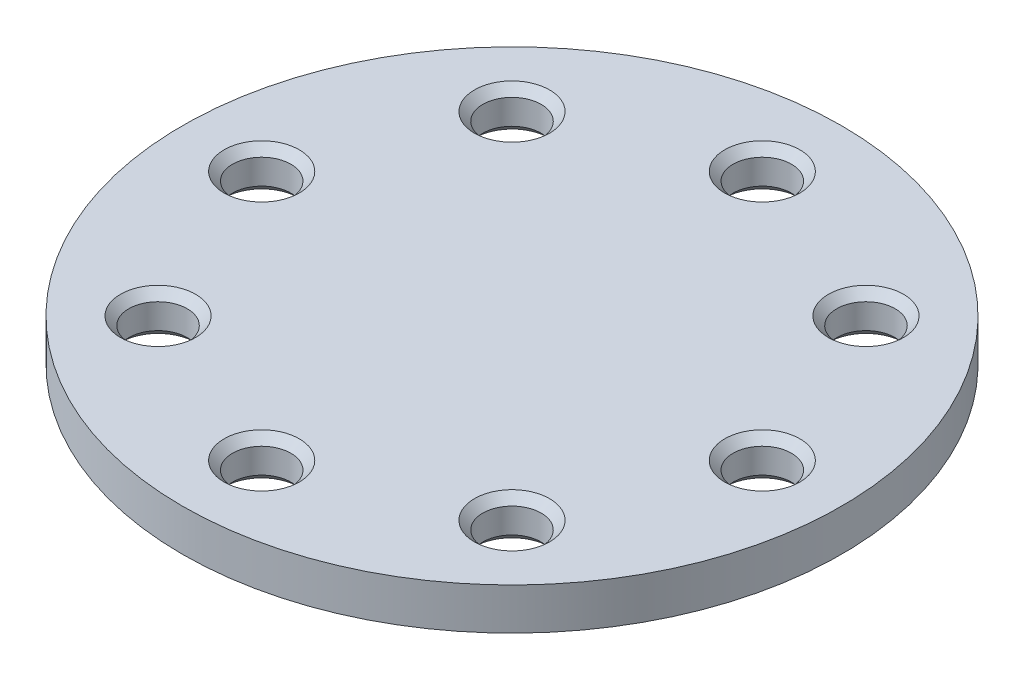
ISO-10303-21;
HEADER;
FILE_DESCRIPTION(('STEP AP214'),'2;1');
FILE_NAME('part.step','',(''),(''),'','','');
FILE_SCHEMA(('AUTOMOTIVE_DESIGN { 1 0 10303 214 1 1 1 1 }'));
ENDSEC;
DATA;
#1=APPLICATION_CONTEXT('core data for automotive mechanical design processes');
#2=APPLICATION_PROTOCOL_DEFINITION('international standard','automotive_design',2000,#1);
#3=PRODUCT_CONTEXT('',#1,'mechanical');
#4=PRODUCT('Part','Part','',(#3));
#5=PRODUCT_RELATED_PRODUCT_CATEGORY('part','',(#4));
#6=PRODUCT_DEFINITION_FORMATION('','',#4);
#7=PRODUCT_DEFINITION_CONTEXT('part definition',#1,'design');
#8=PRODUCT_DEFINITION('design','',#6,#7);
#9=PRODUCT_DEFINITION_SHAPE('','',#8);
#10=(LENGTH_UNIT() NAMED_UNIT(*) SI_UNIT(.MILLI.,.METRE.));
#11=(NAMED_UNIT(*) PLANE_ANGLE_UNIT() SI_UNIT($,.RADIAN.));
#12=(NAMED_UNIT(*) SI_UNIT($,.STERADIAN.) SOLID_ANGLE_UNIT());
#13=UNCERTAINTY_MEASURE_WITH_UNIT(LENGTH_MEASURE(1.E-05),#10,'distance_accuracy_value','');
#14=(GEOMETRIC_REPRESENTATION_CONTEXT(3) GLOBAL_UNCERTAINTY_ASSIGNED_CONTEXT((#13)) GLOBAL_UNIT_ASSIGNED_CONTEXT((#10,
#11,#12)) REPRESENTATION_CONTEXT('',''));
#15=CARTESIAN_POINT('',(0.,0.,0.));
#16=DIRECTION('',(0.,0.,1.));
#17=DIRECTION('',(1.,0.,0.));
#18=AXIS2_PLACEMENT_3D('',#15,#16,#17);
#19=CARTESIAN_POINT('',(0.,5.,-30.));
#20=DIRECTION('',(0.,-1.,0.));
#21=DIRECTION('',(0.,0.,-1.));
#22=AXIS2_PLACEMENT_3D('',#19,#20,#21);
#23=CYLINDRICAL_SURFACE('',#22,3.5);
#24=CARTESIAN_POINT('',(0.,0.999999999999997,-30.));
#25=DIRECTION('',(0.,1.,0.));
#26=DIRECTION('',(0.,0.,1.));
#27=AXIS2_PLACEMENT_3D('',#24,#25,#26);
#28=CIRCLE('',#27,3.5);
#29=CARTESIAN_POINT('',(0.,0.999999999999997,-26.5));
#30=VERTEX_POINT('',#29);
#31=EDGE_CURVE('E76',#30,#30,#28,.F.);
#32=ORIENTED_EDGE('',*,*,#31,.T.);
#33=EDGE_LOOP('',(#32));
#34=FACE_BOUND('',#33,.T.);
#35=CARTESIAN_POINT('',(0.,3.99999999999997,-30.));
#36=DIRECTION('',(0.,1.,0.));
#37=DIRECTION('',(0.,0.,1.));
#38=AXIS2_PLACEMENT_3D('',#35,#36,#37);
#39=CIRCLE('',#38,3.5);
#40=CARTESIAN_POINT('',(0.,3.99999999999997,-26.5));
#41=VERTEX_POINT('',#40);
#42=EDGE_CURVE('E79',#41,#41,#39,.T.);
#43=ORIENTED_EDGE('',*,*,#42,.T.);
#44=EDGE_LOOP('',(#43));
#45=FACE_BOUND('',#44,.T.);
#46=ADVANCED_FACE('F32',(#34,#45),#23,.F.);
#47=CARTESIAN_POINT('',(30.0000000000008,5.,-8.48977342514678E-13));
#48=DIRECTION('',(0.,-1.,0.));
#49=DIRECTION('',(0.,0.,-1.));
#50=AXIS2_PLACEMENT_3D('',#47,#48,#49);
#51=CYLINDRICAL_SURFACE('',#50,3.5);
#52=CARTESIAN_POINT('',(30.0000000000008,0.999999999999991,-8.48977342514678E-13));
#53=DIRECTION('',(0.,1.,0.));
#54=DIRECTION('',(0.,0.,1.));
#55=AXIS2_PLACEMENT_3D('',#52,#53,#54);
#56=CIRCLE('',#55,3.5);
#57=CARTESIAN_POINT('',(30.0000000000008,0.999999999999991,3.49999999999915));
#58=VERTEX_POINT('',#57);
#59=EDGE_CURVE('E52',#58,#58,#56,.F.);
#60=ORIENTED_EDGE('',*,*,#59,.T.);
#61=EDGE_LOOP('',(#60));
#62=FACE_BOUND('',#61,.T.);
#63=CARTESIAN_POINT('',(30.0000000000008,3.99999999999997,-8.48977342514678E-13));
#64=DIRECTION('',(0.,1.,0.));
#65=DIRECTION('',(0.,0.,1.));
#66=AXIS2_PLACEMENT_3D('',#63,#64,#65);
#67=CIRCLE('',#66,3.5);
#68=CARTESIAN_POINT('',(30.0000000000008,3.99999999999997,3.49999999999915));
#69=VERTEX_POINT('',#68);
#70=EDGE_CURVE('E55',#69,#69,#67,.T.);
#71=ORIENTED_EDGE('',*,*,#70,.T.);
#72=EDGE_LOOP('',(#71));
#73=FACE_BOUND('',#72,.T.);
#74=ADVANCED_FACE('F168',(#62,#73),#51,.F.);
#75=CARTESIAN_POINT('',(1.69795468502936E-12,5.,30.));
#76=DIRECTION('',(0.,-1.,0.));
#77=DIRECTION('',(0.,0.,-1.));
#78=AXIS2_PLACEMENT_3D('',#75,#76,#77);
#79=CYLINDRICAL_SURFACE('',#78,3.5);
#80=CARTESIAN_POINT('',(1.69795468502936E-12,3.99999999999997,30.));
#81=DIRECTION('',(0.,1.,0.));
#82=DIRECTION('',(0.,0.,1.));
#83=AXIS2_PLACEMENT_3D('',#80,#81,#82);
#84=CIRCLE('',#83,3.5);
#85=CARTESIAN_POINT('',(1.69795468502936E-12,3.99999999999997,33.5));
#86=VERTEX_POINT('',#85);
#87=EDGE_CURVE('E130',#86,#86,#84,.T.);
#88=ORIENTED_EDGE('',*,*,#87,.T.);
#89=EDGE_LOOP('',(#88));
#90=FACE_BOUND('',#89,.T.);
#91=CARTESIAN_POINT('',(1.69795468502936E-12,0.999999999999993,30.));
#92=DIRECTION('',(0.,1.,0.));
#93=DIRECTION('',(0.,0.,1.));
#94=AXIS2_PLACEMENT_3D('',#91,#92,#93);
#95=CIRCLE('',#94,3.5);
#96=CARTESIAN_POINT('',(1.69795468502936E-12,0.999999999999993,33.5));
#97=VERTEX_POINT('',#96);
#98=EDGE_CURVE('E133',#97,#97,#95,.F.);
#99=ORIENTED_EDGE('',*,*,#98,.T.);
#100=EDGE_LOOP('',(#99));
#101=FACE_BOUND('',#100,.T.);
#102=ADVANCED_FACE('F174',(#90,#101),#79,.F.);
#103=CARTESIAN_POINT('',(-29.9999999999992,5.,8.5265128291212E-13));
#104=DIRECTION('',(0.,-1.,0.));
#105=DIRECTION('',(0.,0.,-1.));
#106=AXIS2_PLACEMENT_3D('',#103,#104,#105);
#107=CYLINDRICAL_SURFACE('',#106,3.5);
#108=CARTESIAN_POINT('',(-29.9999999999992,0.999999999999991,8.5265128291212E-13));
#109=DIRECTION('',(0.,1.,0.));
#110=DIRECTION('',(0.,0.,1.));
#111=AXIS2_PLACEMENT_3D('',#108,#109,#110);
#112=CIRCLE('',#111,3.5);
#113=CARTESIAN_POINT('',(-29.9999999999992,0.999999999999991,3.50000000000085));
#114=VERTEX_POINT('',#113);
#115=EDGE_CURVE('E43',#114,#114,#112,.F.);
#116=ORIENTED_EDGE('',*,*,#115,.T.);
#117=EDGE_LOOP('',(#116));
#118=FACE_BOUND('',#117,.T.);
#119=CARTESIAN_POINT('',(-29.9999999999992,3.99999999999997,8.5265128291212E-13));
#120=DIRECTION('',(0.,1.,0.));
#121=DIRECTION('',(0.,0.,1.));
#122=AXIS2_PLACEMENT_3D('',#119,#120,#121);
#123=CIRCLE('',#122,3.5);
#124=CARTESIAN_POINT('',(-29.9999999999992,3.99999999999997,3.50000000000085));
#125=VERTEX_POINT('',#124);
#126=EDGE_CURVE('E47',#125,#125,#123,.T.);
#127=ORIENTED_EDGE('',*,*,#126,.T.);
#128=EDGE_LOOP('',(#127));
#129=FACE_BOUND('',#128,.T.);
#130=ADVANCED_FACE('F181',(#118,#129),#107,.F.);
#131=CARTESIAN_POINT('',(21.2132034355967,5.,-21.2132034355972));
#132=DIRECTION('',(0.,-1.,0.));
#133=DIRECTION('',(0.,0.,-1.));
#134=AXIS2_PLACEMENT_3D('',#131,#132,#133);
#135=CYLINDRICAL_SURFACE('',#134,3.5);
#136=CARTESIAN_POINT('',(21.2132034355967,3.99999999999998,-21.2132034355972));
#137=DIRECTION('',(0.,1.,0.));
#138=DIRECTION('',(0.,0.,1.));
#139=AXIS2_PLACEMENT_3D('',#136,#137,#138);
#140=CIRCLE('',#139,3.5);
#141=CARTESIAN_POINT('',(21.2132034355967,3.99999999999998,-17.7132034355972));
#142=VERTEX_POINT('',#141);
#143=EDGE_CURVE('E64',#142,#142,#140,.T.);
#144=ORIENTED_EDGE('',*,*,#143,.T.);
#145=EDGE_LOOP('',(#144));
#146=FACE_BOUND('',#145,.T.);
#147=CARTESIAN_POINT('',(21.2132034355967,1.00000000000002,-21.2132034355972));
#148=DIRECTION('',(0.,1.,0.));
#149=DIRECTION('',(0.,0.,1.));
#150=AXIS2_PLACEMENT_3D('',#147,#148,#149);
#151=CIRCLE('',#150,3.5);
#152=CARTESIAN_POINT('',(21.2132034355967,1.00000000000002,-17.7132034355972));
#153=VERTEX_POINT('',#152);
#154=EDGE_CURVE('E67',#153,#153,#151,.F.);
#155=ORIENTED_EDGE('',*,*,#154,.T.);
#156=EDGE_LOOP('',(#155));
#157=FACE_BOUND('',#156,.T.);
#158=ADVANCED_FACE('F185',(#146,#157),#135,.F.);
#159=CARTESIAN_POINT('',(21.2132034355982,5.,21.2132034355957));
#160=DIRECTION('',(0.,-1.,0.));
#161=DIRECTION('',(0.,0.,-1.));
#162=AXIS2_PLACEMENT_3D('',#159,#160,#161);
#163=CYLINDRICAL_SURFACE('',#162,3.5);
#164=CARTESIAN_POINT('',(21.2132034355982,1.00000000000002,21.2132034355957));
#165=DIRECTION('',(0.,1.,0.));
#166=DIRECTION('',(0.,0.,1.));
#167=AXIS2_PLACEMENT_3D('',#164,#165,#166);
#168=CIRCLE('',#167,3.5);
#169=CARTESIAN_POINT('',(21.2132034355982,1.00000000000002,24.7132034355957));
#170=VERTEX_POINT('',#169);
#171=EDGE_CURVE('E70',#170,#170,#168,.F.);
#172=ORIENTED_EDGE('',*,*,#171,.T.);
#173=EDGE_LOOP('',(#172));
#174=FACE_BOUND('',#173,.T.);
#175=CARTESIAN_POINT('',(21.2132034355982,3.99999999999998,21.2132034355957));
#176=DIRECTION('',(0.,1.,0.));
#177=DIRECTION('',(0.,0.,1.));
#178=AXIS2_PLACEMENT_3D('',#175,#176,#177);
#179=CIRCLE('',#178,3.5);
#180=CARTESIAN_POINT('',(21.2132034355982,3.99999999999998,24.7132034355957));
#181=VERTEX_POINT('',#180);
#182=EDGE_CURVE('E73',#181,#181,#179,.T.);
#183=ORIENTED_EDGE('',*,*,#182,.T.);
#184=EDGE_LOOP('',(#183));
#185=FACE_BOUND('',#184,.T.);
#186=ADVANCED_FACE('F189',(#174,#185),#163,.F.);
#187=CARTESIAN_POINT('',(-21.2132034355946,5.,21.2132034355972));
#188=DIRECTION('',(0.,-1.,0.));
#189=DIRECTION('',(0.,0.,-1.));
#190=AXIS2_PLACEMENT_3D('',#187,#188,#189);
#191=CYLINDRICAL_SURFACE('',#190,3.5);
#192=CARTESIAN_POINT('',(-21.2132034355946,1.00000000000002,21.2132034355972));
#193=DIRECTION('',(0.,1.,0.));
#194=DIRECTION('',(0.,0.,1.));
#195=AXIS2_PLACEMENT_3D('',#192,#193,#194);
#196=CIRCLE('',#195,3.5);
#197=CARTESIAN_POINT('',(-21.2132034355946,1.00000000000002,24.7132034355972));
#198=VERTEX_POINT('',#197);
#199=EDGE_CURVE('E10',#198,#198,#196,.F.);
#200=ORIENTED_EDGE('',*,*,#199,.T.);
#201=EDGE_LOOP('',(#200));
#202=FACE_BOUND('',#201,.T.);
#203=CARTESIAN_POINT('',(-21.2132034355946,3.99999999999998,21.2132034355972));
#204=DIRECTION('',(0.,1.,0.));
#205=DIRECTION('',(0.,0.,1.));
#206=AXIS2_PLACEMENT_3D('',#203,#204,#205);
#207=CIRCLE('',#206,3.5);
#208=CARTESIAN_POINT('',(-21.2132034355946,3.99999999999998,24.7132034355972));
#209=VERTEX_POINT('',#208);
#210=EDGE_CURVE('E39',#209,#209,#207,.T.);
#211=ORIENTED_EDGE('',*,*,#210,.T.);
#212=EDGE_LOOP('',(#211));
#213=FACE_BOUND('',#212,.T.);
#214=ADVANCED_FACE('F193',(#202,#213),#191,.F.);
#215=CARTESIAN_POINT('',(-21.2132034355961,5.,-21.2132034355957));
#216=DIRECTION('',(0.,-1.,0.));
#217=DIRECTION('',(0.,0.,-1.));
#218=AXIS2_PLACEMENT_3D('',#215,#216,#217);
#219=CYLINDRICAL_SURFACE('',#218,3.5);
#220=CARTESIAN_POINT('',(-21.2132034355961,3.99999999999998,-21.2132034355957));
#221=DIRECTION('',(0.,1.,0.));
#222=DIRECTION('',(0.,0.,1.));
#223=AXIS2_PLACEMENT_3D('',#220,#221,#222);
#224=CIRCLE('',#223,3.5);
#225=CARTESIAN_POINT('',(-21.2132034355961,3.99999999999998,-17.7132034355957));
#226=VERTEX_POINT('',#225);
#227=EDGE_CURVE('E58',#226,#226,#224,.T.);
#228=ORIENTED_EDGE('',*,*,#227,.T.);
#229=EDGE_LOOP('',(#228));
#230=FACE_BOUND('',#229,.T.);
#231=CARTESIAN_POINT('',(-21.2132034355961,1.00000000000002,-21.2132034355957));
#232=DIRECTION('',(0.,1.,0.));
#233=DIRECTION('',(0.,0.,1.));
#234=AXIS2_PLACEMENT_3D('',#231,#232,#233);
#235=CIRCLE('',#234,3.5);
#236=CARTESIAN_POINT('',(-21.2132034355961,1.00000000000002,-17.7132034355957));
#237=VERTEX_POINT('',#236);
#238=EDGE_CURVE('E61',#237,#237,#235,.F.);
#239=ORIENTED_EDGE('',*,*,#238,.T.);
#240=EDGE_LOOP('',(#239));
#241=FACE_BOUND('',#240,.T.);
#242=ADVANCED_FACE('F148',(#230,#241),#219,.F.);
#243=CARTESIAN_POINT('',(0.,5.,0.));
#244=DIRECTION('',(0.,-1.,0.));
#245=DIRECTION('',(0.,0.,-1.));
#246=AXIS2_PLACEMENT_3D('',#243,#244,#245);
#247=CYLINDRICAL_SURFACE('',#246,39.5);
#248=CARTESIAN_POINT('',(0.,5.,0.));
#249=DIRECTION('',(0.,1.,0.));
#250=DIRECTION('',(0.,0.,1.));
#251=AXIS2_PLACEMENT_3D('',#248,#249,#250);
#252=CIRCLE('',#251,39.5);
#253=CARTESIAN_POINT('',(0.,5.,39.5));
#254=VERTEX_POINT('',#253);
#255=EDGE_CURVE('E136',#254,#254,#252,.T.);
#256=ORIENTED_EDGE('',*,*,#255,.F.);
#257=EDGE_LOOP('',(#256));
#258=FACE_BOUND('',#257,.T.);
#259=CARTESIAN_POINT('',(0.,0.,0.));
#260=DIRECTION('',(0.,1.,0.));
#261=DIRECTION('',(0.,0.,1.));
#262=AXIS2_PLACEMENT_3D('',#259,#260,#261);
#263=CIRCLE('',#262,39.5);
#264=CARTESIAN_POINT('',(0.,0.,39.5));
#265=VERTEX_POINT('',#264);
#266=EDGE_CURVE('E137',#265,#265,#263,.T.);
#267=ORIENTED_EDGE('',*,*,#266,.T.);
#268=EDGE_LOOP('',(#267));
#269=FACE_BOUND('',#268,.T.);
#270=ADVANCED_FACE('F145',(#258,#269),#247,.T.);
#271=CARTESIAN_POINT('',(0.,5.,0.));
#272=DIRECTION('',(0.,1.,0.));
#273=DIRECTION('',(0.,0.,1.));
#274=AXIS2_PLACEMENT_3D('',#271,#272,#273);
#275=PLANE('',#274);
#276=CARTESIAN_POINT('',(1.69795468502936E-12,5.,30.));
#277=DIRECTION('',(0.,1.,0.));
#278=DIRECTION('',(0.,0.,1.));
#279=AXIS2_PLACEMENT_3D('',#276,#277,#278);
#280=CIRCLE('',#279,4.50000000000003);
#281=CARTESIAN_POINT('',(1.69795468502936E-12,5.,34.5));
#282=VERTEX_POINT('',#281);
#283=EDGE_CURVE('E106',#282,#282,#280,.F.);
#284=ORIENTED_EDGE('',*,*,#283,.T.);
#285=EDGE_LOOP('',(#284));
#286=FACE_BOUND('',#285,.T.);
#287=CARTESIAN_POINT('',(0.,5.,-30.));
#288=DIRECTION('',(0.,1.,0.));
#289=DIRECTION('',(0.,0.,1.));
#290=AXIS2_PLACEMENT_3D('',#287,#288,#289);
#291=CIRCLE('',#290,4.50000000000003);
#292=CARTESIAN_POINT('',(0.,5.,-25.5));
#293=VERTEX_POINT('',#292);
#294=EDGE_CURVE('E109',#293,#293,#291,.F.);
#295=ORIENTED_EDGE('',*,*,#294,.T.);
#296=EDGE_LOOP('',(#295));
#297=FACE_BOUND('',#296,.T.);
#298=CARTESIAN_POINT('',(21.2132034355982,5.,21.2132034355957));
#299=DIRECTION('',(0.,1.,0.));
#300=DIRECTION('',(0.,0.,1.));
#301=AXIS2_PLACEMENT_3D('',#298,#299,#300);
#302=CIRCLE('',#301,4.50000000000003);
#303=CARTESIAN_POINT('',(21.2132034355982,5.,25.7132034355957));
#304=VERTEX_POINT('',#303);
#305=EDGE_CURVE('E112',#304,#304,#302,.F.);
#306=ORIENTED_EDGE('',*,*,#305,.T.);
#307=EDGE_LOOP('',(#306));
#308=FACE_BOUND('',#307,.T.);
#309=CARTESIAN_POINT('',(21.2132034355967,5.,-21.2132034355972));
#310=DIRECTION('',(0.,1.,0.));
#311=DIRECTION('',(0.,0.,1.));
#312=AXIS2_PLACEMENT_3D('',#309,#310,#311);
#313=CIRCLE('',#312,4.50000000000003);
#314=CARTESIAN_POINT('',(21.2132034355967,5.,-16.7132034355971));
#315=VERTEX_POINT('',#314);
#316=EDGE_CURVE('E115',#315,#315,#313,.F.);
#317=ORIENTED_EDGE('',*,*,#316,.T.);
#318=EDGE_LOOP('',(#317));
#319=FACE_BOUND('',#318,.T.);
#320=CARTESIAN_POINT('',(-21.2132034355961,5.,-21.2132034355957));
#321=DIRECTION('',(0.,1.,0.));
#322=DIRECTION('',(0.,0.,1.));
#323=AXIS2_PLACEMENT_3D('',#320,#321,#322);
#324=CIRCLE('',#323,4.50000000000003);
#325=CARTESIAN_POINT('',(-21.2132034355961,5.,-16.7132034355956));
#326=VERTEX_POINT('',#325);
#327=EDGE_CURVE('E118',#326,#326,#324,.F.);
#328=ORIENTED_EDGE('',*,*,#327,.T.);
#329=EDGE_LOOP('',(#328));
#330=FACE_BOUND('',#329,.T.);
#331=CARTESIAN_POINT('',(-29.9999999999992,5.,8.5265128291212E-13));
#332=DIRECTION('',(0.,1.,0.));
#333=DIRECTION('',(0.,0.,1.));
#334=AXIS2_PLACEMENT_3D('',#331,#332,#333);
#335=CIRCLE('',#334,4.50000000000003);
#336=CARTESIAN_POINT('',(-29.9999999999992,5.,4.50000000000088));
#337=VERTEX_POINT('',#336);
#338=EDGE_CURVE('E121',#337,#337,#335,.F.);
#339=ORIENTED_EDGE('',*,*,#338,.T.);
#340=EDGE_LOOP('',(#339));
#341=FACE_BOUND('',#340,.T.);
#342=CARTESIAN_POINT('',(-21.2132034355946,5.,21.2132034355972));
#343=DIRECTION('',(0.,1.,0.));
#344=DIRECTION('',(0.,0.,1.));
#345=AXIS2_PLACEMENT_3D('',#342,#343,#344);
#346=CIRCLE('',#345,4.50000000000003);
#347=CARTESIAN_POINT('',(-21.2132034355946,5.,25.7132034355972));
#348=VERTEX_POINT('',#347);
#349=EDGE_CURVE('E124',#348,#348,#346,.F.);
#350=ORIENTED_EDGE('',*,*,#349,.T.);
#351=EDGE_LOOP('',(#350));
#352=FACE_BOUND('',#351,.T.);
#353=CARTESIAN_POINT('',(30.0000000000008,5.,-8.48977342514678E-13));
#354=DIRECTION('',(0.,1.,0.));
#355=DIRECTION('',(0.,0.,1.));
#356=AXIS2_PLACEMENT_3D('',#353,#354,#355);
#357=CIRCLE('',#356,4.50000000000003);
#358=CARTESIAN_POINT('',(30.0000000000008,5.,4.49999999999918));
#359=VERTEX_POINT('',#358);
#360=EDGE_CURVE('E127',#359,#359,#357,.F.);
#361=ORIENTED_EDGE('',*,*,#360,.T.);
#362=EDGE_LOOP('',(#361));
#363=FACE_BOUND('',#362,.T.);
#364=ORIENTED_EDGE('',*,*,#255,.T.);
#365=EDGE_LOOP('',(#364));
#366=FACE_BOUND('',#365,.T.);
#367=ADVANCED_FACE('F143',(#286,#297,#308,#319,#330,#341,#352,#363,#366),#275,.T.);
#368=CARTESIAN_POINT('',(0.,0.,0.));
#369=DIRECTION('',(0.,1.,0.));
#370=DIRECTION('',(0.,0.,1.));
#371=AXIS2_PLACEMENT_3D('',#368,#369,#370);
#372=PLANE('',#371);
#373=CARTESIAN_POINT('',(0.,0.,-30.));
#374=DIRECTION('',(0.,1.,0.));
#375=DIRECTION('',(0.,0.,1.));
#376=AXIS2_PLACEMENT_3D('',#373,#374,#375);
#377=CIRCLE('',#376,4.49999999999999);
#378=CARTESIAN_POINT('',(0.,0.,-25.5));
#379=VERTEX_POINT('',#378);
#380=EDGE_CURVE('E82',#379,#379,#377,.T.);
#381=ORIENTED_EDGE('',*,*,#380,.T.);
#382=EDGE_LOOP('',(#381));
#383=FACE_BOUND('',#382,.T.);
#384=CARTESIAN_POINT('',(21.2132034355982,0.,21.2132034355957));
#385=DIRECTION('',(0.,1.,0.));
#386=DIRECTION('',(0.,0.,1.));
#387=AXIS2_PLACEMENT_3D('',#384,#385,#386);
#388=CIRCLE('',#387,4.5);
#389=CARTESIAN_POINT('',(21.2132034355982,0.,25.7132034355957));
#390=VERTEX_POINT('',#389);
#391=EDGE_CURVE('E85',#390,#390,#388,.T.);
#392=ORIENTED_EDGE('',*,*,#391,.T.);
#393=EDGE_LOOP('',(#392));
#394=FACE_BOUND('',#393,.T.);
#395=CARTESIAN_POINT('',(1.69795468502936E-12,0.,30.));
#396=DIRECTION('',(0.,1.,0.));
#397=DIRECTION('',(0.,0.,1.));
#398=AXIS2_PLACEMENT_3D('',#395,#396,#397);
#399=CIRCLE('',#398,4.49999999999999);
#400=CARTESIAN_POINT('',(1.69795468502936E-12,0.,34.5));
#401=VERTEX_POINT('',#400);
#402=EDGE_CURVE('E88',#401,#401,#399,.T.);
#403=ORIENTED_EDGE('',*,*,#402,.T.);
#404=EDGE_LOOP('',(#403));
#405=FACE_BOUND('',#404,.T.);
#406=CARTESIAN_POINT('',(30.0000000000008,0.,-8.48977342514678E-13));
#407=DIRECTION('',(0.,1.,0.));
#408=DIRECTION('',(0.,0.,1.));
#409=AXIS2_PLACEMENT_3D('',#406,#407,#408);
#410=CIRCLE('',#409,4.49999999999999);
#411=CARTESIAN_POINT('',(30.0000000000008,0.,4.49999999999914));
#412=VERTEX_POINT('',#411);
#413=EDGE_CURVE('E91',#412,#412,#410,.T.);
#414=ORIENTED_EDGE('',*,*,#413,.T.);
#415=EDGE_LOOP('',(#414));
#416=FACE_BOUND('',#415,.T.);
#417=CARTESIAN_POINT('',(21.2132034355967,0.,-21.2132034355972));
#418=DIRECTION('',(0.,1.,0.));
#419=DIRECTION('',(0.,0.,1.));
#420=AXIS2_PLACEMENT_3D('',#417,#418,#419);
#421=CIRCLE('',#420,4.5);
#422=CARTESIAN_POINT('',(21.2132034355967,0.,-16.7132034355972));
#423=VERTEX_POINT('',#422);
#424=EDGE_CURVE('E94',#423,#423,#421,.T.);
#425=ORIENTED_EDGE('',*,*,#424,.T.);
#426=EDGE_LOOP('',(#425));
#427=FACE_BOUND('',#426,.T.);
#428=CARTESIAN_POINT('',(-21.2132034355961,0.,-21.2132034355957));
#429=DIRECTION('',(0.,1.,0.));
#430=DIRECTION('',(0.,0.,1.));
#431=AXIS2_PLACEMENT_3D('',#428,#429,#430);
#432=CIRCLE('',#431,4.5);
#433=CARTESIAN_POINT('',(-21.2132034355961,0.,-16.7132034355957));
#434=VERTEX_POINT('',#433);
#435=EDGE_CURVE('E97',#434,#434,#432,.T.);
#436=ORIENTED_EDGE('',*,*,#435,.T.);
#437=EDGE_LOOP('',(#436));
#438=FACE_BOUND('',#437,.T.);
#439=CARTESIAN_POINT('',(-29.9999999999992,0.,8.5265128291212E-13));
#440=DIRECTION('',(0.,1.,0.));
#441=DIRECTION('',(0.,0.,1.));
#442=AXIS2_PLACEMENT_3D('',#439,#440,#441);
#443=CIRCLE('',#442,4.49999999999999);
#444=CARTESIAN_POINT('',(-29.9999999999992,0.,4.50000000000084));
#445=VERTEX_POINT('',#444);
#446=EDGE_CURVE('E100',#445,#445,#443,.T.);
#447=ORIENTED_EDGE('',*,*,#446,.T.);
#448=EDGE_LOOP('',(#447));
#449=FACE_BOUND('',#448,.T.);
#450=CARTESIAN_POINT('',(-21.2132034355946,0.,21.2132034355972));
#451=DIRECTION('',(0.,1.,0.));
#452=DIRECTION('',(0.,0.,1.));
#453=AXIS2_PLACEMENT_3D('',#450,#451,#452);
#454=CIRCLE('',#453,4.5);
#455=CARTESIAN_POINT('',(-21.2132034355946,0.,25.7132034355972));
#456=VERTEX_POINT('',#455);
#457=EDGE_CURVE('E103',#456,#456,#454,.T.);
#458=ORIENTED_EDGE('',*,*,#457,.T.);
#459=EDGE_LOOP('',(#458));
#460=FACE_BOUND('',#459,.T.);
#461=ORIENTED_EDGE('',*,*,#266,.F.);
#462=EDGE_LOOP('',(#461));
#463=FACE_BOUND('',#462,.T.);
#464=ADVANCED_FACE('F152',(#383,#394,#405,#416,#427,#438,#449,#460,#463),#372,.F.);
#465=CARTESIAN_POINT('',(1.69795468502936E-12,3.99999999999997,30.));
#466=DIRECTION('',(0.,1.,0.));
#467=DIRECTION('',(0.,0.,1.));
#468=AXIS2_PLACEMENT_3D('',#465,#466,#467);
#469=CONICAL_SURFACE('',#468,3.5,0.785398163397449);
#470=ORIENTED_EDGE('',*,*,#283,.F.);
#471=EDGE_LOOP('',(#470));
#472=FACE_BOUND('',#471,.T.);
#473=ORIENTED_EDGE('',*,*,#87,.F.);
#474=EDGE_LOOP('',(#473));
#475=FACE_BOUND('',#474,.T.);
#476=ADVANCED_FACE('F154',(#472,#475),#469,.F.);
#477=CARTESIAN_POINT('',(0.,0.,-30.));
#478=DIRECTION('',(0.,-1.,0.));
#479=DIRECTION('',(0.,0.,-1.));
#480=AXIS2_PLACEMENT_3D('',#477,#478,#479);
#481=CONICAL_SURFACE('',#480,4.49999999999999,0.785398163397446);
#482=ORIENTED_EDGE('',*,*,#31,.F.);
#483=EDGE_LOOP('',(#482));
#484=FACE_BOUND('',#483,.T.);
#485=ORIENTED_EDGE('',*,*,#380,.F.);
#486=EDGE_LOOP('',(#485));
#487=FACE_BOUND('',#486,.T.);
#488=ADVANCED_FACE('F161',(#484,#487),#481,.F.);
#489=CARTESIAN_POINT('',(0.,3.99999999999997,-30.));
#490=DIRECTION('',(0.,1.,0.));
#491=DIRECTION('',(0.,0.,1.));
#492=AXIS2_PLACEMENT_3D('',#489,#490,#491);
#493=CONICAL_SURFACE('',#492,3.5,0.785398163397449);
#494=ORIENTED_EDGE('',*,*,#294,.F.);
#495=EDGE_LOOP('',(#494));
#496=FACE_BOUND('',#495,.T.);
#497=ORIENTED_EDGE('',*,*,#42,.F.);
#498=EDGE_LOOP('',(#497));
#499=FACE_BOUND('',#498,.T.);
#500=ADVANCED_FACE('F202',(#496,#499),#493,.F.);
#501=CARTESIAN_POINT('',(21.2132034355982,0.,21.2132034355957));
#502=DIRECTION('',(0.,-1.,0.));
#503=DIRECTION('',(0.,0.,-1.));
#504=AXIS2_PLACEMENT_3D('',#501,#502,#503);
#505=CONICAL_SURFACE('',#504,4.5,0.785398163397441);
#506=ORIENTED_EDGE('',*,*,#171,.F.);
#507=EDGE_LOOP('',(#506));
#508=FACE_BOUND('',#507,.T.);
#509=ORIENTED_EDGE('',*,*,#391,.F.);
#510=EDGE_LOOP('',(#509));
#511=FACE_BOUND('',#510,.T.);
#512=ADVANCED_FACE('F206',(#508,#511),#505,.F.);
#513=CARTESIAN_POINT('',(21.2132034355982,3.99999999999998,21.2132034355957));
#514=DIRECTION('',(0.,1.,0.));
#515=DIRECTION('',(0.,0.,1.));
#516=AXIS2_PLACEMENT_3D('',#513,#514,#515);
#517=CONICAL_SURFACE('',#516,3.5,0.785398163397456);
#518=ORIENTED_EDGE('',*,*,#305,.F.);
#519=EDGE_LOOP('',(#518));
#520=FACE_BOUND('',#519,.T.);
#521=ORIENTED_EDGE('',*,*,#182,.F.);
#522=EDGE_LOOP('',(#521));
#523=FACE_BOUND('',#522,.T.);
#524=ADVANCED_FACE('F210',(#520,#523),#517,.F.);
#525=CARTESIAN_POINT('',(1.69795468502936E-12,0.,30.));
#526=DIRECTION('',(0.,-1.,0.));
#527=DIRECTION('',(0.,0.,-1.));
#528=AXIS2_PLACEMENT_3D('',#525,#526,#527);
#529=CONICAL_SURFACE('',#528,4.49999999999999,0.785398163397448);
#530=ORIENTED_EDGE('',*,*,#98,.F.);
#531=EDGE_LOOP('',(#530));
#532=FACE_BOUND('',#531,.T.);
#533=ORIENTED_EDGE('',*,*,#402,.F.);
#534=EDGE_LOOP('',(#533));
#535=FACE_BOUND('',#534,.T.);
#536=ADVANCED_FACE('F214',(#532,#535),#529,.F.);
#537=CARTESIAN_POINT('',(21.2132034355967,3.99999999999998,-21.2132034355972));
#538=DIRECTION('',(0.,1.,0.));
#539=DIRECTION('',(0.,0.,1.));
#540=AXIS2_PLACEMENT_3D('',#537,#538,#539);
#541=CONICAL_SURFACE('',#540,3.5,0.785398163397456);
#542=ORIENTED_EDGE('',*,*,#316,.F.);
#543=EDGE_LOOP('',(#542));
#544=FACE_BOUND('',#543,.T.);
#545=ORIENTED_EDGE('',*,*,#143,.F.);
#546=EDGE_LOOP('',(#545));
#547=FACE_BOUND('',#546,.T.);
#548=ADVANCED_FACE('F218',(#544,#547),#541,.F.);
#549=CARTESIAN_POINT('',(-21.2132034355961,3.99999999999998,-21.2132034355957));
#550=DIRECTION('',(0.,1.,0.));
#551=DIRECTION('',(0.,0.,1.));
#552=AXIS2_PLACEMENT_3D('',#549,#550,#551);
#553=CONICAL_SURFACE('',#552,3.5,0.785398163397456);
#554=ORIENTED_EDGE('',*,*,#327,.F.);
#555=EDGE_LOOP('',(#554));
#556=FACE_BOUND('',#555,.T.);
#557=ORIENTED_EDGE('',*,*,#227,.F.);
#558=EDGE_LOOP('',(#557));
#559=FACE_BOUND('',#558,.T.);
#560=ADVANCED_FACE('F222',(#556,#559),#553,.F.);
#561=CARTESIAN_POINT('',(30.0000000000008,0.,-8.48977342514678E-13));
#562=DIRECTION('',(0.,-1.,0.));
#563=DIRECTION('',(0.,0.,-1.));
#564=AXIS2_PLACEMENT_3D('',#561,#562,#563);
#565=CONICAL_SURFACE('',#564,4.49999999999999,0.785398163397448);
#566=ORIENTED_EDGE('',*,*,#59,.F.);
#567=EDGE_LOOP('',(#566));
#568=FACE_BOUND('',#567,.T.);
#569=ORIENTED_EDGE('',*,*,#413,.F.);
#570=EDGE_LOOP('',(#569));
#571=FACE_BOUND('',#570,.T.);
#572=ADVANCED_FACE('F226',(#568,#571),#565,.F.);
#573=CARTESIAN_POINT('',(21.2132034355967,0.,-21.2132034355972));
#574=DIRECTION('',(0.,-1.,0.));
#575=DIRECTION('',(0.,0.,-1.));
#576=AXIS2_PLACEMENT_3D('',#573,#574,#575);
#577=CONICAL_SURFACE('',#576,4.5,0.785398163397441);
#578=ORIENTED_EDGE('',*,*,#154,.F.);
#579=EDGE_LOOP('',(#578));
#580=FACE_BOUND('',#579,.T.);
#581=ORIENTED_EDGE('',*,*,#424,.F.);
#582=EDGE_LOOP('',(#581));
#583=FACE_BOUND('',#582,.T.);
#584=ADVANCED_FACE('F230',(#580,#583),#577,.F.);
#585=CARTESIAN_POINT('',(-21.2132034355961,0.,-21.2132034355957));
#586=DIRECTION('',(0.,-1.,0.));
#587=DIRECTION('',(0.,0.,-1.));
#588=AXIS2_PLACEMENT_3D('',#585,#586,#587);
#589=CONICAL_SURFACE('',#588,4.5,0.785398163397441);
#590=ORIENTED_EDGE('',*,*,#238,.F.);
#591=EDGE_LOOP('',(#590));
#592=FACE_BOUND('',#591,.T.);
#593=ORIENTED_EDGE('',*,*,#435,.F.);
#594=EDGE_LOOP('',(#593));
#595=FACE_BOUND('',#594,.T.);
#596=ADVANCED_FACE('F234',(#592,#595),#589,.F.);
#597=CARTESIAN_POINT('',(-29.9999999999992,0.,8.5265128291212E-13));
#598=DIRECTION('',(0.,-1.,0.));
#599=DIRECTION('',(0.,0.,-1.));
#600=AXIS2_PLACEMENT_3D('',#597,#598,#599);
#601=CONICAL_SURFACE('',#600,4.49999999999999,0.785398163397448);
#602=ORIENTED_EDGE('',*,*,#115,.F.);
#603=EDGE_LOOP('',(#602));
#604=FACE_BOUND('',#603,.T.);
#605=ORIENTED_EDGE('',*,*,#446,.F.);
#606=EDGE_LOOP('',(#605));
#607=FACE_BOUND('',#606,.T.);
#608=ADVANCED_FACE('F238',(#604,#607),#601,.F.);
#609=CARTESIAN_POINT('',(-21.2132034355946,0.,21.2132034355972));
#610=DIRECTION('',(0.,-1.,0.));
#611=DIRECTION('',(0.,0.,-1.));
#612=AXIS2_PLACEMENT_3D('',#609,#610,#611);
#613=CONICAL_SURFACE('',#612,4.5,0.785398163397441);
#614=ORIENTED_EDGE('',*,*,#199,.F.);
#615=EDGE_LOOP('',(#614));
#616=FACE_BOUND('',#615,.T.);
#617=ORIENTED_EDGE('',*,*,#457,.F.);
#618=EDGE_LOOP('',(#617));
#619=FACE_BOUND('',#618,.T.);
#620=ADVANCED_FACE('F242',(#616,#619),#613,.F.);
#621=CARTESIAN_POINT('',(-29.9999999999992,3.99999999999997,8.5265128291212E-13));
#622=DIRECTION('',(0.,1.,0.));
#623=DIRECTION('',(0.,0.,1.));
#624=AXIS2_PLACEMENT_3D('',#621,#622,#623);
#625=CONICAL_SURFACE('',#624,3.5,0.785398163397449);
#626=ORIENTED_EDGE('',*,*,#338,.F.);
#627=EDGE_LOOP('',(#626));
#628=FACE_BOUND('',#627,.T.);
#629=ORIENTED_EDGE('',*,*,#126,.F.);
#630=EDGE_LOOP('',(#629));
#631=FACE_BOUND('',#630,.T.);
#632=ADVANCED_FACE('F246',(#628,#631),#625,.F.);
#633=CARTESIAN_POINT('',(-21.2132034355946,3.99999999999998,21.2132034355972));
#634=DIRECTION('',(0.,1.,0.));
#635=DIRECTION('',(0.,0.,1.));
#636=AXIS2_PLACEMENT_3D('',#633,#634,#635);
#637=CONICAL_SURFACE('',#636,3.5,0.785398163397456);
#638=ORIENTED_EDGE('',*,*,#349,.F.);
#639=EDGE_LOOP('',(#638));
#640=FACE_BOUND('',#639,.T.);
#641=ORIENTED_EDGE('',*,*,#210,.F.);
#642=EDGE_LOOP('',(#641));
#643=FACE_BOUND('',#642,.T.);
#644=ADVANCED_FACE('F249',(#640,#643),#637,.F.);
#645=CARTESIAN_POINT('',(30.0000000000008,3.99999999999997,-8.48977342514678E-13));
#646=DIRECTION('',(0.,1.,0.));
#647=DIRECTION('',(0.,0.,1.));
#648=AXIS2_PLACEMENT_3D('',#645,#646,#647);
#649=CONICAL_SURFACE('',#648,3.5,0.785398163397449);
#650=ORIENTED_EDGE('',*,*,#360,.F.);
#651=EDGE_LOOP('',(#650));
#652=FACE_BOUND('',#651,.T.);
#653=ORIENTED_EDGE('',*,*,#70,.F.);
#654=EDGE_LOOP('',(#653));
#655=FACE_BOUND('',#654,.T.);
#656=ADVANCED_FACE('F34',(#652,#655),#649,.F.);
#657=CLOSED_SHELL('',(#46,#74,#102,#130,#158,#186,#214,#242,#270,#367,#464,#476,#488,#500,#512,
#524,#536,#548,#560,#572,#584,#596,#608,#620,#632,#644,#656));
#658=MANIFOLD_SOLID_BREP('B2',#657);
#659=ADVANCED_BREP_SHAPE_REPRESENTATION('',(#18,#658),#14);
#660=SHAPE_DEFINITION_REPRESENTATION(#9,#659);
ENDSEC;
END-ISO-10303-21;
